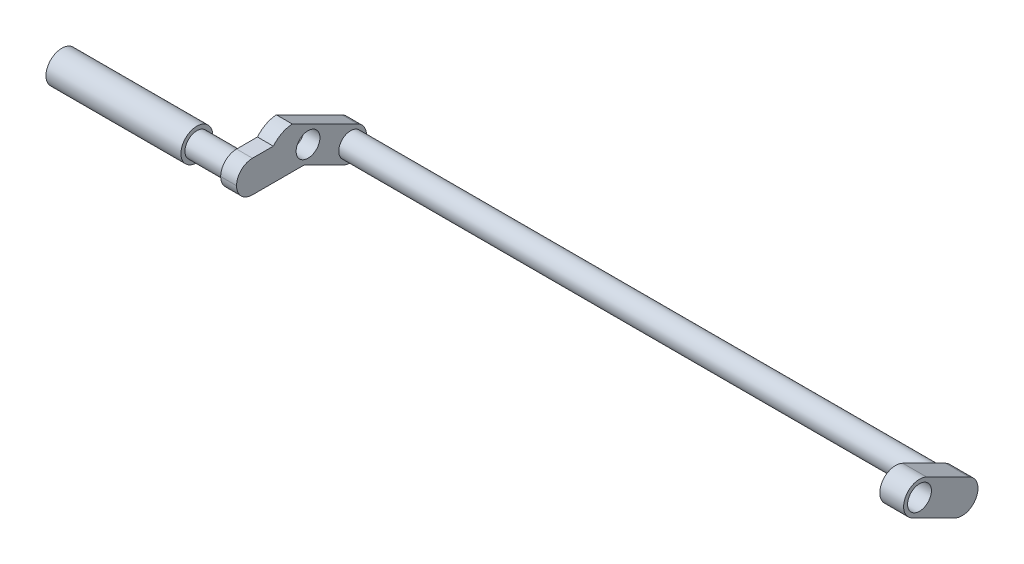
ISO-10303-21;
HEADER;
FILE_DESCRIPTION(('STEP AP214'),'2;1');
FILE_NAME('part.step','',(''),(''),'','','');
FILE_SCHEMA(('AUTOMOTIVE_DESIGN { 1 0 10303 214 1 1 1 1 }'));
ENDSEC;
DATA;
#1=APPLICATION_CONTEXT('core data for automotive mechanical design processes');
#2=APPLICATION_PROTOCOL_DEFINITION('international standard','automotive_design',2000,#1);
#3=PRODUCT_CONTEXT('',#1,'mechanical');
#4=PRODUCT('Part','Part','',(#3));
#5=PRODUCT_RELATED_PRODUCT_CATEGORY('part','',(#4));
#6=PRODUCT_DEFINITION_FORMATION('','',#4);
#7=PRODUCT_DEFINITION_CONTEXT('part definition',#1,'design');
#8=PRODUCT_DEFINITION('design','',#6,#7);
#9=PRODUCT_DEFINITION_SHAPE('','',#8);
#10=(LENGTH_UNIT() NAMED_UNIT(*) SI_UNIT(.MILLI.,.METRE.));
#11=(NAMED_UNIT(*) PLANE_ANGLE_UNIT() SI_UNIT($,.RADIAN.));
#12=(NAMED_UNIT(*) SI_UNIT($,.STERADIAN.) SOLID_ANGLE_UNIT());
#13=UNCERTAINTY_MEASURE_WITH_UNIT(LENGTH_MEASURE(1.E-05),#10,'distance_accuracy_value','');
#14=(GEOMETRIC_REPRESENTATION_CONTEXT(3) GLOBAL_UNCERTAINTY_ASSIGNED_CONTEXT((#13)) GLOBAL_UNIT_ASSIGNED_CONTEXT((#10,
#11,#12)) REPRESENTATION_CONTEXT('',''));
#15=CARTESIAN_POINT('',(0.,0.,0.));
#16=DIRECTION('',(0.,0.,1.));
#17=DIRECTION('',(1.,0.,0.));
#18=AXIS2_PLACEMENT_3D('',#15,#16,#17);
#19=CARTESIAN_POINT('',(22.,-2.,2.));
#20=DIRECTION('',(0.,-1.,0.));
#21=DIRECTION('',(0.,0.,-1.));
#22=AXIS2_PLACEMENT_3D('',#19,#20,#21);
#23=PLANE('',#22);
#24=DIRECTION('',(0.,0.,-1.));
#25=VECTOR('',#24,1.);
#26=CARTESIAN_POINT('',(22.,-2.,2.));
#27=LINE('',#26,#25);
#28=CARTESIAN_POINT('',(22.,-2.,0.));
#29=VERTEX_POINT('',#28);
#30=CARTESIAN_POINT('',(22.,-2.,-6.52824085538602));
#31=VERTEX_POINT('',#30);
#32=EDGE_CURVE('E78',#29,#31,#27,.T.);
#33=ORIENTED_EDGE('',*,*,#32,.T.);
#34=DIRECTION('',(1.,0.,0.));
#35=VECTOR('',#34,1.);
#36=CARTESIAN_POINT('',(22.,-2.,-6.52824085538602));
#37=LINE('',#36,#35);
#38=CARTESIAN_POINT('',(24.,-2.,-6.52824085538602));
#39=VERTEX_POINT('',#38);
#40=EDGE_CURVE('E83',#31,#39,#37,.T.);
#41=ORIENTED_EDGE('',*,*,#40,.T.);
#42=DIRECTION('',(0.,0.,-1.));
#43=VECTOR('',#42,1.);
#44=CARTESIAN_POINT('',(24.,-2.,2.));
#45=LINE('',#44,#43);
#46=CARTESIAN_POINT('',(24.,-2.,0.));
#47=VERTEX_POINT('',#46);
#48=EDGE_CURVE('E222',#47,#39,#45,.T.);
#49=ORIENTED_EDGE('',*,*,#48,.F.);
#50=DIRECTION('',(1.,0.,0.));
#51=VECTOR('',#50,1.);
#52=CARTESIAN_POINT('',(22.,-2.,0.));
#53=LINE('',#52,#51);
#54=EDGE_CURVE('E254',#47,#29,#53,.F.);
#55=ORIENTED_EDGE('',*,*,#54,.T.);
#56=EDGE_LOOP('',(#33,#41,#49,#55));
#57=FACE_BOUND('',#56,.T.);
#58=ADVANCED_FACE('F62',(#57),#23,.T.);
#59=CARTESIAN_POINT('',(22.,2.,2.));
#60=DIRECTION('',(0.,1.,0.));
#61=DIRECTION('',(0.,0.,1.));
#62=AXIS2_PLACEMENT_3D('',#59,#60,#61);
#63=PLANE('',#62);
#64=DIRECTION('',(0.,0.,1.));
#65=VECTOR('',#64,1.);
#66=CARTESIAN_POINT('',(24.,2.,2.));
#67=LINE('',#66,#65);
#68=CARTESIAN_POINT('',(24.,2.,-2.62891392887271));
#69=VERTEX_POINT('',#68);
#70=CARTESIAN_POINT('',(24.,2.,0.));
#71=VERTEX_POINT('',#70);
#72=EDGE_CURVE('E225',#69,#71,#67,.T.);
#73=ORIENTED_EDGE('',*,*,#72,.F.);
#74=DIRECTION('',(1.,0.,0.));
#75=VECTOR('',#74,1.);
#76=CARTESIAN_POINT('',(22.,2.,-2.62891392887271));
#77=LINE('',#76,#75);
#78=CARTESIAN_POINT('',(22.,2.,-2.62891392887271));
#79=VERTEX_POINT('',#78);
#80=EDGE_CURVE('E208',#79,#69,#77,.T.);
#81=ORIENTED_EDGE('',*,*,#80,.F.);
#82=DIRECTION('',(0.,0.,1.));
#83=VECTOR('',#82,1.);
#84=CARTESIAN_POINT('',(22.,2.,2.));
#85=LINE('',#84,#83);
#86=CARTESIAN_POINT('',(22.,2.,0.));
#87=VERTEX_POINT('',#86);
#88=EDGE_CURVE('E224',#79,#87,#85,.T.);
#89=ORIENTED_EDGE('',*,*,#88,.T.);
#90=DIRECTION('',(1.,0.,0.));
#91=VECTOR('',#90,1.);
#92=CARTESIAN_POINT('',(22.,2.,0.));
#93=LINE('',#92,#91);
#94=EDGE_CURVE('E241',#87,#71,#93,.T.);
#95=ORIENTED_EDGE('',*,*,#94,.T.);
#96=EDGE_LOOP('',(#73,#81,#89,#95));
#97=FACE_BOUND('',#96,.T.);
#98=ADVANCED_FACE('F274',(#97),#63,.T.);
#99=CARTESIAN_POINT('',(24.,0.,0.));
#100=DIRECTION('',(-1.,0.,0.));
#101=DIRECTION('',(0.,0.,1.));
#102=AXIS2_PLACEMENT_3D('',#99,#100,#101);
#103=CYLINDRICAL_SURFACE('',#102,1.5);
#104=CARTESIAN_POINT('',(17.,0.,0.));
#105=DIRECTION('',(1.,0.,0.));
#106=DIRECTION('',(0.,0.,-1.));
#107=AXIS2_PLACEMENT_3D('',#104,#105,#106);
#108=CIRCLE('',#107,1.5);
#109=CARTESIAN_POINT('',(17.,0.,-1.5));
#110=VERTEX_POINT('',#109);
#111=EDGE_CURVE('E230',#110,#110,#108,.T.);
#112=ORIENTED_EDGE('',*,*,#111,.T.);
#113=EDGE_LOOP('',(#112));
#114=FACE_BOUND('',#113,.T.);
#115=CARTESIAN_POINT('',(22.,0.,0.));
#116=DIRECTION('',(1.,0.,0.));
#117=DIRECTION('',(0.,0.,-1.));
#118=AXIS2_PLACEMENT_3D('',#115,#116,#117);
#119=CIRCLE('',#118,1.5);
#120=CARTESIAN_POINT('',(22.,0.,-1.5));
#121=VERTEX_POINT('',#120);
#122=EDGE_CURVE('E233',#121,#121,#119,.T.);
#123=ORIENTED_EDGE('',*,*,#122,.F.);
#124=EDGE_LOOP('',(#123));
#125=FACE_BOUND('',#124,.T.);
#126=ADVANCED_FACE('F295',(#114,#125),#103,.T.);
#127=CARTESIAN_POINT('',(17.,0.,0.));
#128=DIRECTION('',(-1.,0.,0.));
#129=DIRECTION('',(0.,0.,1.));
#130=AXIS2_PLACEMENT_3D('',#127,#128,#129);
#131=CYLINDRICAL_SURFACE('',#130,2.);
#132=CARTESIAN_POINT('',(17.,0.,0.));
#133=DIRECTION('',(1.,0.,0.));
#134=DIRECTION('',(0.,0.,-1.));
#135=AXIS2_PLACEMENT_3D('',#132,#133,#134);
#136=CIRCLE('',#135,2.);
#137=CARTESIAN_POINT('',(17.,0.,-2.));
#138=VERTEX_POINT('',#137);
#139=EDGE_CURVE('E234',#138,#138,#136,.T.);
#140=ORIENTED_EDGE('',*,*,#139,.F.);
#141=EDGE_LOOP('',(#140));
#142=FACE_BOUND('',#141,.T.);
#143=CARTESIAN_POINT('',(0.,0.,0.));
#144=DIRECTION('',(1.,0.,0.));
#145=DIRECTION('',(0.,0.,-1.));
#146=AXIS2_PLACEMENT_3D('',#143,#144,#145);
#147=CIRCLE('',#146,2.);
#148=CARTESIAN_POINT('',(0.,0.,-2.));
#149=VERTEX_POINT('',#148);
#150=EDGE_CURVE('E227',#149,#149,#147,.T.);
#151=ORIENTED_EDGE('',*,*,#150,.T.);
#152=EDGE_LOOP('',(#151));
#153=FACE_BOUND('',#152,.T.);
#154=ADVANCED_FACE('F304',(#142,#153),#131,.T.);
#155=CARTESIAN_POINT('',(17.,0.,0.));
#156=DIRECTION('',(1.,0.,0.));
#157=DIRECTION('',(0.,0.,-1.));
#158=AXIS2_PLACEMENT_3D('',#155,#156,#157);
#159=PLANE('',#158);
#160=ORIENTED_EDGE('',*,*,#111,.F.);
#161=EDGE_LOOP('',(#160));
#162=FACE_BOUND('',#161,.T.);
#163=ORIENTED_EDGE('',*,*,#139,.T.);
#164=EDGE_LOOP('',(#163));
#165=FACE_BOUND('',#164,.T.);
#166=ADVANCED_FACE('F306',(#162,#165),#159,.T.);
#167=CARTESIAN_POINT('',(0.,0.,0.));
#168=DIRECTION('',(1.,0.,0.));
#169=DIRECTION('',(0.,0.,-1.));
#170=AXIS2_PLACEMENT_3D('',#167,#168,#169);
#171=PLANE('',#170);
#172=ORIENTED_EDGE('',*,*,#150,.F.);
#173=EDGE_LOOP('',(#172));
#174=FACE_BOUND('',#173,.T.);
#175=ADVANCED_FACE('F309',(#174),#171,.F.);
#176=CARTESIAN_POINT('',(22.,0.,0.));
#177=DIRECTION('',(1.,0.,0.));
#178=DIRECTION('',(0.,0.,-1.));
#179=AXIS2_PLACEMENT_3D('',#176,#177,#178);
#180=PLANE('',#179);
#181=ORIENTED_EDGE('',*,*,#88,.F.);
#182=CARTESIAN_POINT('',(22.,-0.211708643637673,-5.28324877392475));
#183=DIRECTION('',(1.,0.,0.));
#184=DIRECTION('',(0.,0.,-1.));
#185=AXIS2_PLACEMENT_3D('',#182,#183,#184);
#186=CIRCLE('',#185,3.45501788620537);
#187=CARTESIAN_POINT('',(22.,3.23211346377748,-5.00533172429002));
#188=VERTEX_POINT('',#187);
#189=EDGE_CURVE('E202',#79,#188,#186,.F.);
#190=ORIENTED_EDGE('',*,*,#189,.T.);
#191=DIRECTION('',(0.,-0.446894314690762,-0.894586760184318));
#192=VECTOR('',#191,1.);
#193=CARTESIAN_POINT('',(22.,4.58767368023663,-2.291790328902));
#194=LINE('',#193,#192);
#195=CARTESIAN_POINT('',(22.,-0.892192367775933,-13.2613091904874));
#196=VERTEX_POINT('',#195);
#197=EDGE_CURVE('E205',#188,#196,#194,.T.);
#198=ORIENTED_EDGE('',*,*,#197,.T.);
#199=CARTESIAN_POINT('',(22.,-2.68136588814457,-12.3675205611059));
#200=DIRECTION('',(1.,0.,0.));
#201=DIRECTION('',(0.,0.,-1.));
#202=AXIS2_PLACEMENT_3D('',#199,#200,#201);
#203=CIRCLE('',#202,2.);
#204=CARTESIAN_POINT('',(22.,-4.47053940851321,-11.4737319317244));
#205=VERTEX_POINT('',#204);
#206=EDGE_CURVE('E191',#205,#196,#203,.T.);
#207=ORIENTED_EDGE('',*,*,#206,.F.);
#208=DIRECTION('',(0.,0.446894314690762,0.894586760184318));
#209=VECTOR('',#208,1.);
#210=CARTESIAN_POINT('',(22.,1.00932663949936,-0.504213070138955));
#211=LINE('',#210,#209);
#212=EDGE_CURVE('E190',#205,#31,#211,.T.);
#213=ORIENTED_EDGE('',*,*,#212,.T.);
#214=ORIENTED_EDGE('',*,*,#32,.F.);
#215=CARTESIAN_POINT('',(22.,0.,0.));
#216=DIRECTION('',(1.,0.,0.));
#217=DIRECTION('',(0.,0.,-1.));
#218=AXIS2_PLACEMENT_3D('',#215,#216,#217);
#219=CIRCLE('',#218,2.);
#220=CARTESIAN_POINT('',(22.,0.,2.));
#221=VERTEX_POINT('',#220);
#222=EDGE_CURVE('E66',#29,#221,#219,.F.);
#223=ORIENTED_EDGE('',*,*,#222,.T.);
#224=CARTESIAN_POINT('',(22.,0.,0.));
#225=DIRECTION('',(1.,0.,0.));
#226=DIRECTION('',(0.,0.,-1.));
#227=AXIS2_PLACEMENT_3D('',#224,#225,#226);
#228=CIRCLE('',#227,2.);
#229=EDGE_CURVE('E250',#221,#87,#228,.F.);
#230=ORIENTED_EDGE('',*,*,#229,.T.);
#231=EDGE_LOOP('',(#181,#190,#198,#207,#213,#214,#223,#230));
#232=FACE_BOUND('',#231,.T.);
#233=CARTESIAN_POINT('',(22.,0.,-7.));
#234=DIRECTION('',(1.,0.,0.));
#235=DIRECTION('',(0.,0.,-1.));
#236=AXIS2_PLACEMENT_3D('',#233,#234,#235);
#237=CIRCLE('',#236,1.5);
#238=CARTESIAN_POINT('',(22.,0.,-8.5));
#239=VERTEX_POINT('',#238);
#240=EDGE_CURVE('E219',#239,#239,#237,.T.);
#241=ORIENTED_EDGE('',*,*,#240,.T.);
#242=EDGE_LOOP('',(#241));
#243=FACE_BOUND('',#242,.T.);
#244=ORIENTED_EDGE('',*,*,#122,.T.);
#245=EDGE_LOOP('',(#244));
#246=FACE_BOUND('',#245,.T.);
#247=ADVANCED_FACE('F260',(#232,#243,#246),#180,.F.);
#248=CARTESIAN_POINT('',(24.,0.,0.));
#249=DIRECTION('',(1.,0.,0.));
#250=DIRECTION('',(0.,0.,-1.));
#251=AXIS2_PLACEMENT_3D('',#248,#249,#250);
#252=PLANE('',#251);
#253=CARTESIAN_POINT('',(24.,-2.68136588814457,-12.3675205611059));
#254=DIRECTION('',(1.,0.,0.));
#255=DIRECTION('',(0.,0.,-1.));
#256=AXIS2_PLACEMENT_3D('',#253,#254,#255);
#257=CIRCLE('',#256,1.5);
#258=CARTESIAN_POINT('',(24.,-2.68136588814457,-13.8675205611059));
#259=VERTEX_POINT('',#258);
#260=EDGE_CURVE('E12',#259,#259,#257,.T.);
#261=ORIENTED_EDGE('',*,*,#260,.F.);
#262=EDGE_LOOP('',(#261));
#263=FACE_BOUND('',#262,.T.);
#264=CARTESIAN_POINT('',(24.,-2.68136588814457,-12.3675205611059));
#265=DIRECTION('',(1.,0.,0.));
#266=DIRECTION('',(0.,0.,-1.));
#267=AXIS2_PLACEMENT_3D('',#264,#265,#266);
#268=CIRCLE('',#267,2.);
#269=CARTESIAN_POINT('',(24.,-4.47053940851321,-11.4737319317244));
#270=VERTEX_POINT('',#269);
#271=CARTESIAN_POINT('',(24.,-0.892192367775933,-13.2613091904874));
#272=VERTEX_POINT('',#271);
#273=EDGE_CURVE('E193',#270,#272,#268,.T.);
#274=ORIENTED_EDGE('',*,*,#273,.T.);
#275=DIRECTION('',(0.,-0.446894314690762,-0.894586760184318));
#276=VECTOR('',#275,1.);
#277=CARTESIAN_POINT('',(24.,4.58767368023663,-2.291790328902));
#278=LINE('',#277,#276);
#279=CARTESIAN_POINT('',(24.,3.23211346377748,-5.00533172429002));
#280=VERTEX_POINT('',#279);
#281=EDGE_CURVE('E206',#280,#272,#278,.T.);
#282=ORIENTED_EDGE('',*,*,#281,.F.);
#283=CARTESIAN_POINT('',(24.,-0.211708643637673,-5.28324877392475));
#284=DIRECTION('',(1.,0.,0.));
#285=DIRECTION('',(0.,0.,-1.));
#286=AXIS2_PLACEMENT_3D('',#283,#284,#285);
#287=CIRCLE('',#286,3.45501788620537);
#288=EDGE_CURVE('E196',#69,#280,#287,.F.);
#289=ORIENTED_EDGE('',*,*,#288,.F.);
#290=ORIENTED_EDGE('',*,*,#72,.T.);
#291=CARTESIAN_POINT('',(24.,0.,0.));
#292=DIRECTION('',(1.,0.,0.));
#293=DIRECTION('',(0.,0.,-1.));
#294=AXIS2_PLACEMENT_3D('',#291,#292,#293);
#295=CIRCLE('',#294,2.);
#296=CARTESIAN_POINT('',(24.,0.,2.));
#297=VERTEX_POINT('',#296);
#298=EDGE_CURVE('E244',#71,#297,#295,.T.);
#299=ORIENTED_EDGE('',*,*,#298,.T.);
#300=CARTESIAN_POINT('',(24.,0.,0.));
#301=DIRECTION('',(1.,0.,0.));
#302=DIRECTION('',(0.,0.,-1.));
#303=AXIS2_PLACEMENT_3D('',#300,#301,#302);
#304=CIRCLE('',#303,2.);
#305=EDGE_CURVE('E253',#297,#47,#304,.T.);
#306=ORIENTED_EDGE('',*,*,#305,.T.);
#307=ORIENTED_EDGE('',*,*,#48,.T.);
#308=DIRECTION('',(0.,0.446894314690762,0.894586760184318));
#309=VECTOR('',#308,1.);
#310=CARTESIAN_POINT('',(24.,1.00932663949936,-0.504213070138955));
#311=LINE('',#310,#309);
#312=EDGE_CURVE('E179',#270,#39,#311,.T.);
#313=ORIENTED_EDGE('',*,*,#312,.F.);
#314=EDGE_LOOP('',(#274,#282,#289,#290,#299,#306,#307,#313));
#315=FACE_BOUND('',#314,.T.);
#316=CARTESIAN_POINT('',(24.,0.,-7.));
#317=DIRECTION('',(1.,0.,0.));
#318=DIRECTION('',(0.,0.,-1.));
#319=AXIS2_PLACEMENT_3D('',#316,#317,#318);
#320=CIRCLE('',#319,1.5);
#321=CARTESIAN_POINT('',(24.,0.,-8.5));
#322=VERTEX_POINT('',#321);
#323=EDGE_CURVE('E215',#322,#322,#320,.T.);
#324=ORIENTED_EDGE('',*,*,#323,.F.);
#325=EDGE_LOOP('',(#324));
#326=FACE_BOUND('',#325,.T.);
#327=ADVANCED_FACE('F269',(#263,#315,#326),#252,.T.);
#328=CARTESIAN_POINT('',(22.,0.,0.));
#329=DIRECTION('',(1.,0.,0.));
#330=DIRECTION('',(0.,0.,-1.));
#331=AXIS2_PLACEMENT_3D('',#328,#329,#330);
#332=CYLINDRICAL_SURFACE('',#331,2.);
#333=ORIENTED_EDGE('',*,*,#229,.F.);
#334=DIRECTION('',(1.,0.,0.));
#335=VECTOR('',#334,1.);
#336=CARTESIAN_POINT('',(22.,0.,2.));
#337=LINE('',#336,#335);
#338=EDGE_CURVE('E247',#297,#221,#337,.F.);
#339=ORIENTED_EDGE('',*,*,#338,.F.);
#340=ORIENTED_EDGE('',*,*,#298,.F.);
#341=ORIENTED_EDGE('',*,*,#94,.F.);
#342=EDGE_LOOP('',(#333,#339,#340,#341));
#343=FACE_BOUND('',#342,.T.);
#344=ADVANCED_FACE('F266',(#343),#332,.T.);
#345=CARTESIAN_POINT('',(22.,0.,0.));
#346=DIRECTION('',(1.,0.,0.));
#347=DIRECTION('',(0.,0.,-1.));
#348=AXIS2_PLACEMENT_3D('',#345,#346,#347);
#349=CYLINDRICAL_SURFACE('',#348,2.);
#350=ORIENTED_EDGE('',*,*,#222,.F.);
#351=ORIENTED_EDGE('',*,*,#54,.F.);
#352=ORIENTED_EDGE('',*,*,#305,.F.);
#353=ORIENTED_EDGE('',*,*,#338,.T.);
#354=EDGE_LOOP('',(#350,#351,#352,#353));
#355=FACE_BOUND('',#354,.T.);
#356=ADVANCED_FACE('F64',(#355),#349,.T.);
#357=CARTESIAN_POINT('',(0.,0.,-7.));
#358=DIRECTION('',(1.,0.,0.));
#359=DIRECTION('',(0.,0.,-1.));
#360=AXIS2_PLACEMENT_3D('',#357,#358,#359);
#361=CYLINDRICAL_SURFACE('',#360,1.5);
#362=ORIENTED_EDGE('',*,*,#323,.T.);
#363=EDGE_LOOP('',(#362));
#364=FACE_BOUND('',#363,.T.);
#365=ORIENTED_EDGE('',*,*,#240,.F.);
#366=EDGE_LOOP('',(#365));
#367=FACE_BOUND('',#366,.T.);
#368=ADVANCED_FACE('F320',(#364,#367),#361,.F.);
#369=CARTESIAN_POINT('',(22.,-0.211708643637673,-5.28324877392475));
#370=DIRECTION('',(1.,0.,0.));
#371=DIRECTION('',(0.,0.,-1.));
#372=AXIS2_PLACEMENT_3D('',#369,#370,#371);
#373=CYLINDRICAL_SURFACE('',#372,3.45501788620537);
#374=ORIENTED_EDGE('',*,*,#288,.T.);
#375=DIRECTION('',(1.,0.,0.));
#376=VECTOR('',#375,1.);
#377=CARTESIAN_POINT('',(22.,3.23211346377748,-5.00533172429002));
#378=LINE('',#377,#376);
#379=EDGE_CURVE('E212',#188,#280,#378,.T.);
#380=ORIENTED_EDGE('',*,*,#379,.F.);
#381=ORIENTED_EDGE('',*,*,#189,.F.);
#382=ORIENTED_EDGE('',*,*,#80,.T.);
#383=EDGE_LOOP('',(#374,#380,#381,#382));
#384=FACE_BOUND('',#383,.T.);
#385=ADVANCED_FACE('F280',(#384),#373,.T.);
#386=CARTESIAN_POINT('',(22.,4.58767368023663,-2.291790328902));
#387=DIRECTION('',(0.,-0.894586760184318,0.446894314690762));
#388=DIRECTION('',(0.,-0.446894314690762,-0.894586760184318));
#389=AXIS2_PLACEMENT_3D('',#386,#387,#388);
#390=PLANE('',#389);
#391=ORIENTED_EDGE('',*,*,#281,.T.);
#392=DIRECTION('',(1.,0.,0.));
#393=VECTOR('',#392,1.);
#394=CARTESIAN_POINT('',(22.,-0.892192367775933,-13.2613091904874));
#395=LINE('',#394,#393);
#396=EDGE_CURVE('E187',#196,#272,#395,.T.);
#397=ORIENTED_EDGE('',*,*,#396,.F.);
#398=ORIENTED_EDGE('',*,*,#197,.F.);
#399=ORIENTED_EDGE('',*,*,#379,.T.);
#400=EDGE_LOOP('',(#391,#397,#398,#399));
#401=FACE_BOUND('',#400,.T.);
#402=ADVANCED_FACE('F282',(#401),#390,.F.);
#403=CARTESIAN_POINT('',(22.,1.00932663949936,-0.504213070138955));
#404=DIRECTION('',(0.,0.894586760184318,-0.446894314690762));
#405=DIRECTION('',(0.,0.446894314690762,0.894586760184318));
#406=AXIS2_PLACEMENT_3D('',#403,#404,#405);
#407=PLANE('',#406);
#408=ORIENTED_EDGE('',*,*,#312,.T.);
#409=ORIENTED_EDGE('',*,*,#40,.F.);
#410=ORIENTED_EDGE('',*,*,#212,.F.);
#411=DIRECTION('',(1.,0.,0.));
#412=VECTOR('',#411,1.);
#413=CARTESIAN_POINT('',(22.,-4.47053940851321,-11.4737319317244));
#414=LINE('',#413,#412);
#415=EDGE_CURVE('E185',#205,#270,#414,.T.);
#416=ORIENTED_EDGE('',*,*,#415,.T.);
#417=EDGE_LOOP('',(#408,#409,#410,#416));
#418=FACE_BOUND('',#417,.T.);
#419=ADVANCED_FACE('F288',(#418),#407,.F.);
#420=CARTESIAN_POINT('',(22.,-2.68136588814457,-12.3675205611059));
#421=DIRECTION('',(1.,0.,0.));
#422=DIRECTION('',(0.,0.,-1.));
#423=AXIS2_PLACEMENT_3D('',#420,#421,#422);
#424=CYLINDRICAL_SURFACE('',#423,2.);
#425=ORIENTED_EDGE('',*,*,#273,.F.);
#426=ORIENTED_EDGE('',*,*,#415,.F.);
#427=ORIENTED_EDGE('',*,*,#206,.T.);
#428=ORIENTED_EDGE('',*,*,#396,.T.);
#429=EDGE_LOOP('',(#425,#426,#427,#428));
#430=FACE_BOUND('',#429,.T.);
#431=ADVANCED_FACE('F285',(#430),#424,.T.);
#432=CARTESIAN_POINT('',(98.,-2.68136588814457,-12.3675205611059));
#433=DIRECTION('',(-1.,0.,0.));
#434=DIRECTION('',(0.,0.,1.));
#435=AXIS2_PLACEMENT_3D('',#432,#433,#434);
#436=CYLINDRICAL_SURFACE('',#435,1.5);
#437=CARTESIAN_POINT('',(98.,-2.68136588814457,-12.3675205611059));
#438=DIRECTION('',(1.,0.,0.));
#439=DIRECTION('',(0.,0.,-1.));
#440=AXIS2_PLACEMENT_3D('',#437,#438,#439);
#441=CIRCLE('',#440,1.5);
#442=CARTESIAN_POINT('',(98.,-2.68136588814457,-13.8675205611059));
#443=VERTEX_POINT('',#442);
#444=EDGE_CURVE('E176',#443,#443,#441,.T.);
#445=ORIENTED_EDGE('',*,*,#444,.F.);
#446=EDGE_LOOP('',(#445));
#447=FACE_BOUND('',#446,.T.);
#448=ORIENTED_EDGE('',*,*,#260,.T.);
#449=EDGE_LOOP('',(#448));
#450=FACE_BOUND('',#449,.T.);
#451=ADVANCED_FACE('F355',(#447,#450),#436,.T.);
#452=CARTESIAN_POINT('',(101.,0.,-7.));
#453=DIRECTION('',(-1.,0.,0.));
#454=DIRECTION('',(0.,0.,1.));
#455=AXIS2_PLACEMENT_3D('',#452,#453,#454);
#456=CYLINDRICAL_SURFACE('',#455,2.);
#457=CARTESIAN_POINT('',(98.,0.,-7.));
#458=DIRECTION('',(1.,0.,0.));
#459=DIRECTION('',(0.,0.,-1.));
#460=AXIS2_PLACEMENT_3D('',#457,#458,#459);
#461=CIRCLE('',#460,2.);
#462=CARTESIAN_POINT('',(98.,1.78917352036864,-7.89378862938152));
#463=VERTEX_POINT('',#462);
#464=CARTESIAN_POINT('',(98.,-1.78917352036864,-6.10621137061848));
#465=VERTEX_POINT('',#464);
#466=EDGE_CURVE('E175',#463,#465,#461,.T.);
#467=ORIENTED_EDGE('',*,*,#466,.T.);
#468=DIRECTION('',(-1.,0.,0.));
#469=VECTOR('',#468,1.);
#470=CARTESIAN_POINT('',(101.,-1.78917352036864,-6.10621137061848));
#471=LINE('',#470,#469);
#472=CARTESIAN_POINT('',(101.,-1.78917352036864,-6.10621137061848));
#473=VERTEX_POINT('',#472);
#474=EDGE_CURVE('E156',#473,#465,#471,.T.);
#475=ORIENTED_EDGE('',*,*,#474,.F.);
#476=CARTESIAN_POINT('',(101.,0.,-7.));
#477=DIRECTION('',(1.,0.,0.));
#478=DIRECTION('',(0.,0.,-1.));
#479=AXIS2_PLACEMENT_3D('',#476,#477,#478);
#480=CIRCLE('',#479,2.);
#481=CARTESIAN_POINT('',(101.,1.78917352036864,-7.89378862938152));
#482=VERTEX_POINT('',#481);
#483=EDGE_CURVE('E163',#482,#473,#480,.T.);
#484=ORIENTED_EDGE('',*,*,#483,.F.);
#485=DIRECTION('',(-1.,0.,0.));
#486=VECTOR('',#485,1.);
#487=CARTESIAN_POINT('',(101.,1.78917352036864,-7.89378862938152));
#488=LINE('',#487,#486);
#489=EDGE_CURVE('E474',#482,#463,#488,.T.);
#490=ORIENTED_EDGE('',*,*,#489,.T.);
#491=EDGE_LOOP('',(#467,#475,#484,#490));
#492=FACE_BOUND('',#491,.T.);
#493=ADVANCED_FACE('F173',(#492),#456,.T.);
#494=CARTESIAN_POINT('',(101.,1.00932663949936,-0.504213070138954));
#495=DIRECTION('',(0.,0.894586760184318,-0.446894314690762));
#496=DIRECTION('',(0.,0.446894314690762,0.894586760184318));
#497=AXIS2_PLACEMENT_3D('',#494,#495,#496);
#498=PLANE('',#497);
#499=DIRECTION('',(0.,-0.446894314690762,-0.894586760184318));
#500=VECTOR('',#499,1.);
#501=CARTESIAN_POINT('',(98.,1.00932663949936,-0.504213070138954));
#502=LINE('',#501,#500);
#503=CARTESIAN_POINT('',(98.,-4.47053940851321,-11.4737319317244));
#504=VERTEX_POINT('',#503);
#505=EDGE_CURVE('E472',#465,#504,#502,.T.);
#506=ORIENTED_EDGE('',*,*,#505,.T.);
#507=DIRECTION('',(-1.,0.,0.));
#508=VECTOR('',#507,1.);
#509=CARTESIAN_POINT('',(101.,-4.47053940851321,-11.4737319317244));
#510=LINE('',#509,#508);
#511=CARTESIAN_POINT('',(101.,-4.47053940851321,-11.4737319317244));
#512=VERTEX_POINT('',#511);
#513=EDGE_CURVE('E159',#512,#504,#510,.T.);
#514=ORIENTED_EDGE('',*,*,#513,.F.);
#515=DIRECTION('',(0.,-0.446894314690762,-0.894586760184318));
#516=VECTOR('',#515,1.);
#517=CARTESIAN_POINT('',(101.,1.00932663949936,-0.504213070138954));
#518=LINE('',#517,#516);
#519=EDGE_CURVE('E152',#473,#512,#518,.T.);
#520=ORIENTED_EDGE('',*,*,#519,.F.);
#521=ORIENTED_EDGE('',*,*,#474,.T.);
#522=EDGE_LOOP('',(#506,#514,#520,#521));
#523=FACE_BOUND('',#522,.T.);
#524=ADVANCED_FACE('F154',(#523),#498,.F.);
#525=CARTESIAN_POINT('',(101.,-2.68136588814457,-12.3675205611059));
#526=DIRECTION('',(-1.,0.,0.));
#527=DIRECTION('',(0.,0.,1.));
#528=AXIS2_PLACEMENT_3D('',#525,#526,#527);
#529=CYLINDRICAL_SURFACE('',#528,2.);
#530=CARTESIAN_POINT('',(98.,-2.68136588814457,-12.3675205611059));
#531=DIRECTION('',(1.,0.,0.));
#532=DIRECTION('',(0.,0.,-1.));
#533=AXIS2_PLACEMENT_3D('',#530,#531,#532);
#534=CIRCLE('',#533,2.);
#535=CARTESIAN_POINT('',(98.,-0.892192367775933,-13.2613091904874));
#536=VERTEX_POINT('',#535);
#537=EDGE_CURVE('E477',#504,#536,#534,.T.);
#538=ORIENTED_EDGE('',*,*,#537,.T.);
#539=DIRECTION('',(-1.,0.,0.));
#540=VECTOR('',#539,1.);
#541=CARTESIAN_POINT('',(101.,-0.892192367775933,-13.2613091904874));
#542=LINE('',#541,#540);
#543=CARTESIAN_POINT('',(101.,-0.892192367775933,-13.2613091904874));
#544=VERTEX_POINT('',#543);
#545=EDGE_CURVE('E181',#544,#536,#542,.T.);
#546=ORIENTED_EDGE('',*,*,#545,.F.);
#547=CARTESIAN_POINT('',(101.,-2.68136588814457,-12.3675205611059));
#548=DIRECTION('',(1.,0.,0.));
#549=DIRECTION('',(0.,0.,-1.));
#550=AXIS2_PLACEMENT_3D('',#547,#548,#549);
#551=CIRCLE('',#550,2.);
#552=EDGE_CURVE('E162',#512,#544,#551,.T.);
#553=ORIENTED_EDGE('',*,*,#552,.F.);
#554=ORIENTED_EDGE('',*,*,#513,.T.);
#555=EDGE_LOOP('',(#538,#546,#553,#554));
#556=FACE_BOUND('',#555,.T.);
#557=ADVANCED_FACE('F377',(#556),#529,.T.);
#558=CARTESIAN_POINT('',(101.,0.,-7.));
#559=DIRECTION('',(-1.,0.,0.));
#560=DIRECTION('',(0.,0.,1.));
#561=AXIS2_PLACEMENT_3D('',#558,#559,#560);
#562=CYLINDRICAL_SURFACE('',#561,1.5);
#563=CARTESIAN_POINT('',(101.,0.,-7.));
#564=DIRECTION('',(1.,0.,0.));
#565=DIRECTION('',(0.,0.,-1.));
#566=AXIS2_PLACEMENT_3D('',#563,#564,#565);
#567=CIRCLE('',#566,1.5);
#568=CARTESIAN_POINT('',(101.,0.,-8.5));
#569=VERTEX_POINT('',#568);
#570=EDGE_CURVE('E171',#569,#569,#567,.T.);
#571=ORIENTED_EDGE('',*,*,#570,.T.);
#572=EDGE_LOOP('',(#571));
#573=FACE_BOUND('',#572,.T.);
#574=CARTESIAN_POINT('',(98.,0.,-7.));
#575=DIRECTION('',(1.,0.,0.));
#576=DIRECTION('',(0.,0.,-1.));
#577=AXIS2_PLACEMENT_3D('',#574,#575,#576);
#578=CIRCLE('',#577,1.5);
#579=CARTESIAN_POINT('',(98.,0.,-8.5));
#580=VERTEX_POINT('',#579);
#581=EDGE_CURVE('E467',#580,#580,#578,.T.);
#582=ORIENTED_EDGE('',*,*,#581,.F.);
#583=EDGE_LOOP('',(#582));
#584=FACE_BOUND('',#583,.T.);
#585=ADVANCED_FACE('F386',(#573,#584),#562,.F.);
#586=CARTESIAN_POINT('',(101.,4.58767368023663,-2.291790328902));
#587=DIRECTION('',(0.,0.894586760184318,-0.446894314690762));
#588=DIRECTION('',(0.,0.446894314690762,0.894586760184318));
#589=AXIS2_PLACEMENT_3D('',#586,#587,#588);
#590=PLANE('',#589);
#591=DIRECTION('',(0.,-0.446894314690762,-0.894586760184318));
#592=VECTOR('',#591,1.);
#593=CARTESIAN_POINT('',(98.,4.58767368023663,-2.291790328902));
#594=LINE('',#593,#592);
#595=EDGE_CURVE('E471',#463,#536,#594,.T.);
#596=ORIENTED_EDGE('',*,*,#595,.F.);
#597=ORIENTED_EDGE('',*,*,#489,.F.);
#598=DIRECTION('',(0.,-0.446894314690762,-0.894586760184318));
#599=VECTOR('',#598,1.);
#600=CARTESIAN_POINT('',(101.,4.58767368023663,-2.291790328902));
#601=LINE('',#600,#599);
#602=EDGE_CURVE('E169',#482,#544,#601,.T.);
#603=ORIENTED_EDGE('',*,*,#602,.T.);
#604=ORIENTED_EDGE('',*,*,#545,.T.);
#605=EDGE_LOOP('',(#596,#597,#603,#604));
#606=FACE_BOUND('',#605,.T.);
#607=ADVANCED_FACE('F396',(#606),#590,.T.);
#608=CARTESIAN_POINT('',(101.,0.,0.));
#609=DIRECTION('',(1.,0.,0.));
#610=DIRECTION('',(0.,0.,-1.));
#611=AXIS2_PLACEMENT_3D('',#608,#609,#610);
#612=PLANE('',#611);
#613=ORIENTED_EDGE('',*,*,#570,.F.);
#614=EDGE_LOOP('',(#613));
#615=FACE_BOUND('',#614,.T.);
#616=ORIENTED_EDGE('',*,*,#483,.T.);
#617=ORIENTED_EDGE('',*,*,#519,.T.);
#618=ORIENTED_EDGE('',*,*,#552,.T.);
#619=ORIENTED_EDGE('',*,*,#602,.F.);
#620=EDGE_LOOP('',(#616,#617,#618,#619));
#621=FACE_BOUND('',#620,.T.);
#622=ADVANCED_FACE('F167',(#615,#621),#612,.T.);
#623=CARTESIAN_POINT('',(98.,0.,0.));
#624=DIRECTION('',(1.,0.,0.));
#625=DIRECTION('',(0.,0.,-1.));
#626=AXIS2_PLACEMENT_3D('',#623,#624,#625);
#627=PLANE('',#626);
#628=ORIENTED_EDGE('',*,*,#444,.T.);
#629=EDGE_LOOP('',(#628));
#630=FACE_BOUND('',#629,.T.);
#631=ORIENTED_EDGE('',*,*,#581,.T.);
#632=EDGE_LOOP('',(#631));
#633=FACE_BOUND('',#632,.T.);
#634=ORIENTED_EDGE('',*,*,#466,.F.);
#635=ORIENTED_EDGE('',*,*,#595,.T.);
#636=ORIENTED_EDGE('',*,*,#537,.F.);
#637=ORIENTED_EDGE('',*,*,#505,.F.);
#638=EDGE_LOOP('',(#634,#635,#636,#637));
#639=FACE_BOUND('',#638,.T.);
#640=ADVANCED_FACE('F416',(#630,#633,#639),#627,.F.);
#641=CLOSED_SHELL('',(#58,#98,#126,#154,#166,#175,#247,#327,#344,#356,#368,#385,#402,#419,#431,
#451,#493,#524,#557,#585,#607,#622,#640));
#642=MANIFOLD_SOLID_BREP('B2',#641);
#643=ADVANCED_BREP_SHAPE_REPRESENTATION('',(#18,#642),#14);
#644=SHAPE_DEFINITION_REPRESENTATION(#9,#643);
ENDSEC;
END-ISO-10303-21;
